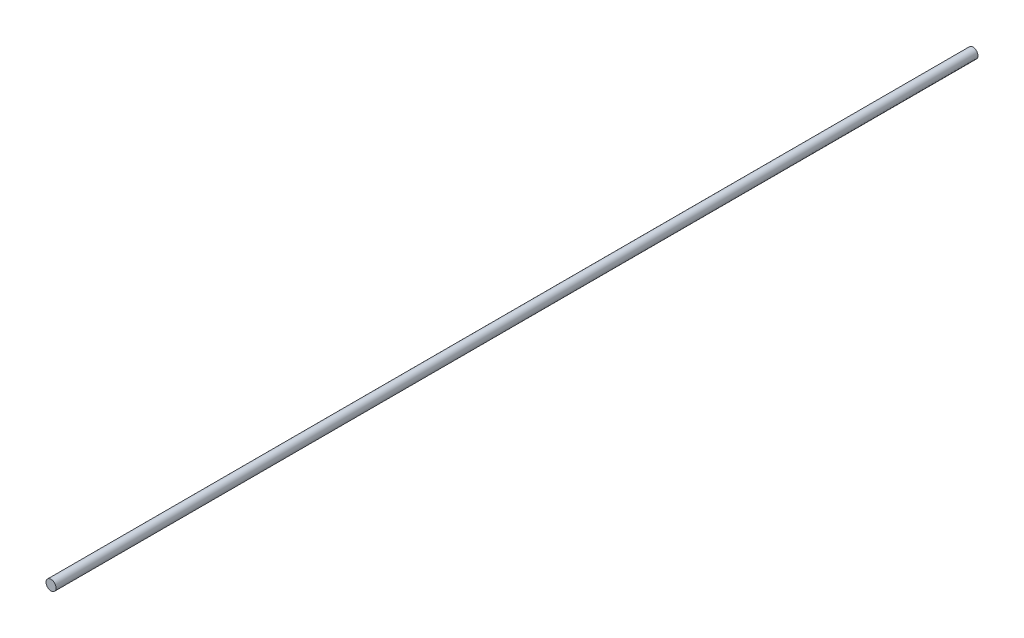
ISO-10303-21;
HEADER;
FILE_DESCRIPTION(('STEP AP214'),'2;1');
FILE_NAME('part.step','',(''),(''),'','','');
FILE_SCHEMA(('AUTOMOTIVE_DESIGN { 1 0 10303 214 1 1 1 1 }'));
ENDSEC;
DATA;
#1=APPLICATION_CONTEXT('core data for automotive mechanical design processes');
#2=APPLICATION_PROTOCOL_DEFINITION('international standard','automotive_design',2000,#1);
#3=PRODUCT_CONTEXT('',#1,'mechanical');
#4=PRODUCT('Part','Part','',(#3));
#5=PRODUCT_RELATED_PRODUCT_CATEGORY('part','',(#4));
#6=PRODUCT_DEFINITION_FORMATION('','',#4);
#7=PRODUCT_DEFINITION_CONTEXT('part definition',#1,'design');
#8=PRODUCT_DEFINITION('design','',#6,#7);
#9=PRODUCT_DEFINITION_SHAPE('','',#8);
#10=(LENGTH_UNIT() NAMED_UNIT(*) SI_UNIT(.MILLI.,.METRE.));
#11=(NAMED_UNIT(*) PLANE_ANGLE_UNIT() SI_UNIT($,.RADIAN.));
#12=(NAMED_UNIT(*) SI_UNIT($,.STERADIAN.) SOLID_ANGLE_UNIT());
#13=UNCERTAINTY_MEASURE_WITH_UNIT(LENGTH_MEASURE(1.E-05),#10,'distance_accuracy_value','');
#14=(GEOMETRIC_REPRESENTATION_CONTEXT(3) GLOBAL_UNCERTAINTY_ASSIGNED_CONTEXT((#13)) GLOBAL_UNIT_ASSIGNED_CONTEXT((#10,
#11,#12)) REPRESENTATION_CONTEXT('',''));
#15=CARTESIAN_POINT('',(0.,0.,0.));
#16=DIRECTION('',(0.,0.,1.));
#17=DIRECTION('',(1.,0.,0.));
#18=AXIS2_PLACEMENT_3D('',#15,#16,#17);
#19=CARTESIAN_POINT('',(0.,0.,560.));
#20=DIRECTION('',(0.,0.,-1.));
#21=DIRECTION('',(-1.,0.,0.));
#22=AXIS2_PLACEMENT_3D('',#19,#20,#21);
#23=CYLINDRICAL_SURFACE('',#22,6.1);
#24=CARTESIAN_POINT('',(0.,0.,560.));
#25=DIRECTION('',(0.,0.,1.));
#26=DIRECTION('',(1.,0.,0.));
#27=AXIS2_PLACEMENT_3D('',#24,#25,#26);
#28=CIRCLE('',#27,6.1);
#29=CARTESIAN_POINT('',(6.1,0.,560.));
#30=VERTEX_POINT('',#29);
#31=EDGE_CURVE('E10',#30,#30,#28,.T.);
#32=ORIENTED_EDGE('',*,*,#31,.F.);
#33=EDGE_LOOP('',(#32));
#34=FACE_BOUND('',#33,.T.);
#35=CARTESIAN_POINT('',(0.,0.,-560.));
#36=DIRECTION('',(0.,0.,1.));
#37=DIRECTION('',(1.,0.,0.));
#38=AXIS2_PLACEMENT_3D('',#35,#36,#37);
#39=CIRCLE('',#38,6.1);
#40=CARTESIAN_POINT('',(6.1,0.,-560.));
#41=VERTEX_POINT('',#40);
#42=EDGE_CURVE('E40',#41,#41,#39,.T.);
#43=ORIENTED_EDGE('',*,*,#42,.T.);
#44=EDGE_LOOP('',(#43));
#45=FACE_BOUND('',#44,.T.);
#46=ADVANCED_FACE('F37',(#34,#45),#23,.T.);
#47=CARTESIAN_POINT('',(0.,0.,560.));
#48=DIRECTION('',(0.,0.,1.));
#49=DIRECTION('',(1.,0.,0.));
#50=AXIS2_PLACEMENT_3D('',#47,#48,#49);
#51=PLANE('',#50);
#52=ORIENTED_EDGE('',*,*,#31,.T.);
#53=EDGE_LOOP('',(#52));
#54=FACE_BOUND('',#53,.T.);
#55=ADVANCED_FACE('F54',(#54),#51,.T.);
#56=CARTESIAN_POINT('',(0.,0.,-560.));
#57=DIRECTION('',(0.,0.,1.));
#58=DIRECTION('',(1.,0.,0.));
#59=AXIS2_PLACEMENT_3D('',#56,#57,#58);
#60=PLANE('',#59);
#61=ORIENTED_EDGE('',*,*,#42,.F.);
#62=EDGE_LOOP('',(#61));
#63=FACE_BOUND('',#62,.T.);
#64=ADVANCED_FACE('F52',(#63),#60,.F.);
#65=CLOSED_SHELL('',(#46,#55,#64));
#66=MANIFOLD_SOLID_BREP('B2',#65);
#67=ADVANCED_BREP_SHAPE_REPRESENTATION('',(#18,#66),#14);
#68=SHAPE_DEFINITION_REPRESENTATION(#9,#67);
ENDSEC;
END-ISO-10303-21;
